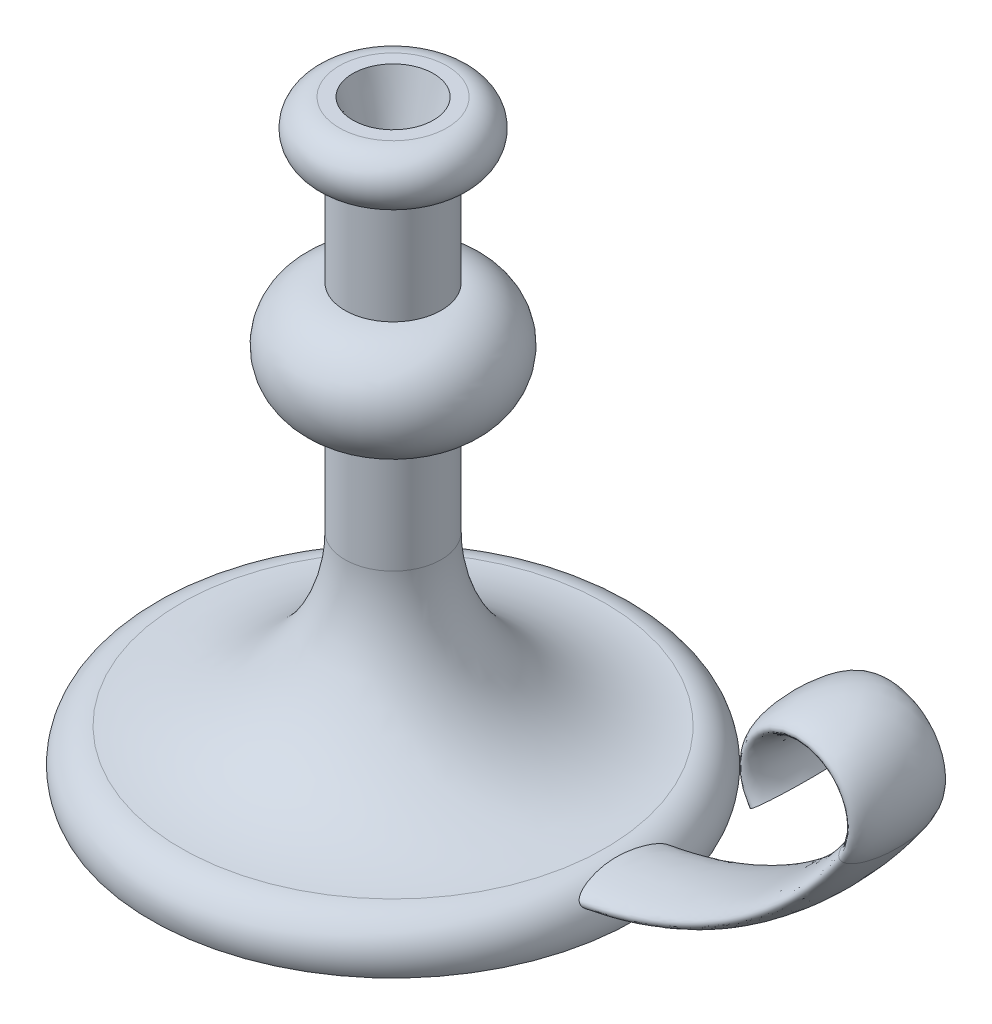
ISO-10303-21;
HEADER;
FILE_DESCRIPTION(('STEP AP214'),'2;1');
FILE_NAME('part.step','',(''),(''),'','','');
FILE_SCHEMA(('AUTOMOTIVE_DESIGN { 1 0 10303 214 1 1 1 1 }'));
ENDSEC;
DATA;
#1=APPLICATION_CONTEXT('core data for automotive mechanical design processes');
#2=APPLICATION_PROTOCOL_DEFINITION('international standard','automotive_design',2000,#1);
#3=PRODUCT_CONTEXT('',#1,'mechanical');
#4=PRODUCT('Part','Part','',(#3));
#5=PRODUCT_RELATED_PRODUCT_CATEGORY('part','',(#4));
#6=PRODUCT_DEFINITION_FORMATION('','',#4);
#7=PRODUCT_DEFINITION_CONTEXT('part definition',#1,'design');
#8=PRODUCT_DEFINITION('design','',#6,#7);
#9=PRODUCT_DEFINITION_SHAPE('','',#8);
#10=(LENGTH_UNIT() NAMED_UNIT(*) SI_UNIT(.MILLI.,.METRE.));
#11=(NAMED_UNIT(*) PLANE_ANGLE_UNIT() SI_UNIT($,.RADIAN.));
#12=(NAMED_UNIT(*) SI_UNIT($,.STERADIAN.) SOLID_ANGLE_UNIT());
#13=UNCERTAINTY_MEASURE_WITH_UNIT(LENGTH_MEASURE(1.E-05),#10,'distance_accuracy_value','');
#14=(GEOMETRIC_REPRESENTATION_CONTEXT(3) GLOBAL_UNCERTAINTY_ASSIGNED_CONTEXT((#13)) GLOBAL_UNIT_ASSIGNED_CONTEXT((#10,
#11,#12)) REPRESENTATION_CONTEXT('',''));
#15=CARTESIAN_POINT('',(0.,0.,0.));
#16=DIRECTION('',(0.,0.,1.));
#17=DIRECTION('',(1.,0.,0.));
#18=AXIS2_PLACEMENT_3D('',#15,#16,#17);
#19=CARTESIAN_POINT('',(0.,0.,0.));
#20=DIRECTION('',(0.,-1.,0.));
#21=DIRECTION('',(0.,0.,-1.));
#22=AXIS2_PLACEMENT_3D('',#19,#20,#21);
#23=PLANE('',#22);
#24=CARTESIAN_POINT('',(0.,0.,0.));
#25=DIRECTION('',(0.,-1.,0.));
#26=DIRECTION('',(0.,0.,-1.));
#27=AXIS2_PLACEMENT_3D('',#24,#25,#26);
#28=CIRCLE('',#27,90.);
#29=CARTESIAN_POINT('',(0.,0.,-90.));
#30=VERTEX_POINT('',#29);
#31=EDGE_CURVE('E78',#30,#30,#28,.T.);
#32=ORIENTED_EDGE('',*,*,#31,.T.);
#33=EDGE_LOOP('',(#32));
#34=FACE_BOUND('',#33,.T.);
#35=ADVANCED_FACE('F38',(#34),#23,.T.);
#36=CARTESIAN_POINT('',(20.,220.,0.));
#37=DIRECTION('',(0.,1.,0.));
#38=DIRECTION('',(0.,0.,1.));
#39=AXIS2_PLACEMENT_3D('',#36,#37,#38);
#40=PLANE('',#39);
#41=CARTESIAN_POINT('',(0.,220.,0.));
#42=DIRECTION('',(0.,1.,0.));
#43=DIRECTION('',(0.,0.,1.));
#44=AXIS2_PLACEMENT_3D('',#41,#42,#43);
#45=CIRCLE('',#44,15.);
#46=CARTESIAN_POINT('',(0.,220.,15.));
#47=VERTEX_POINT('',#46);
#48=EDGE_CURVE('E94',#47,#47,#45,.T.);
#49=ORIENTED_EDGE('',*,*,#48,.F.);
#50=EDGE_LOOP('',(#49));
#51=FACE_BOUND('',#50,.T.);
#52=CARTESIAN_POINT('',(0.,220.,0.));
#53=DIRECTION('',(0.,-1.,0.));
#54=DIRECTION('',(0.,0.,-1.));
#55=AXIS2_PLACEMENT_3D('',#52,#53,#54);
#56=CIRCLE('',#55,20.);
#57=CARTESIAN_POINT('',(0.,220.,-20.));
#58=VERTEX_POINT('',#57);
#59=EDGE_CURVE('E50',#58,#58,#56,.T.);
#60=ORIENTED_EDGE('',*,*,#59,.F.);
#61=EDGE_LOOP('',(#60));
#62=FACE_BOUND('',#61,.T.);
#63=ADVANCED_FACE('F101',(#51,#62),#40,.T.);
#64=CARTESIAN_POINT('',(0.,210.,0.));
#65=DIRECTION('',(0.,-1.,0.));
#66=DIRECTION('',(0.,0.,-1.));
#67=AXIS2_PLACEMENT_3D('',#64,#65,#66);
#68=TOROIDAL_SURFACE('',#67,20.,10.);
#69=ORIENTED_EDGE('',*,*,#59,.T.);
#70=EDGE_LOOP('',(#69));
#71=FACE_BOUND('',#70,.T.);
#72=CARTESIAN_POINT('',(0.,200.221610295999,0.));
#73=DIRECTION('',(0.,-1.,0.));
#74=DIRECTION('',(0.,0.,-1.));
#75=AXIS2_PLACEMENT_3D('',#72,#73,#74);
#76=CIRCLE('',#75,17.9064158013873);
#77=CARTESIAN_POINT('',(0.,200.221610295999,-17.9064158013873));
#78=VERTEX_POINT('',#77);
#79=EDGE_CURVE('E55',#78,#78,#76,.T.);
#80=ORIENTED_EDGE('',*,*,#79,.F.);
#81=EDGE_LOOP('',(#80));
#82=FACE_BOUND('',#81,.T.);
#83=ADVANCED_FACE('F104',(#71,#82),#68,.T.);
#84=CARTESIAN_POINT('',(0.,0.,0.));
#85=DIRECTION('',(0.,-1.,0.));
#86=DIRECTION('',(0.,0.,-1.));
#87=AXIS2_PLACEMENT_3D('',#84,#85,#86);
#88=CYLINDRICAL_SURFACE('',#87,17.9064158013873);
#89=ORIENTED_EDGE('',*,*,#79,.T.);
#90=EDGE_LOOP('',(#89));
#91=FACE_BOUND('',#90,.T.);
#92=CARTESIAN_POINT('',(0.,160.221610295999,0.));
#93=DIRECTION('',(0.,-1.,0.));
#94=DIRECTION('',(0.,0.,-1.));
#95=AXIS2_PLACEMENT_3D('',#92,#93,#94);
#96=CIRCLE('',#95,17.9064158013873);
#97=CARTESIAN_POINT('',(0.,160.221610295999,-17.9064158013873));
#98=VERTEX_POINT('',#97);
#99=EDGE_CURVE('E60',#98,#98,#96,.T.);
#100=ORIENTED_EDGE('',*,*,#99,.F.);
#101=EDGE_LOOP('',(#100));
#102=FACE_BOUND('',#101,.T.);
#103=ADVANCED_FACE('F110',(#91,#102),#88,.T.);
#104=CARTESIAN_POINT('',(0.,140.224286636559,0.));
#105=DIRECTION('',(0.,-1.,0.));
#106=DIRECTION('',(0.,0.,-1.));
#107=AXIS2_PLACEMENT_3D('',#104,#105,#106);
#108=DEGENERATE_TOROIDAL_SURFACE('',#107,17.5792362488077,20.,.T.);
#109=ORIENTED_EDGE('',*,*,#99,.T.);
#110=EDGE_LOOP('',(#109));
#111=FACE_BOUND('',#110,.T.);
#112=CARTESIAN_POINT('',(0.,120.22696297712,0.));
#113=DIRECTION('',(0.,-1.,0.));
#114=DIRECTION('',(0.,0.,-1.));
#115=AXIS2_PLACEMENT_3D('',#112,#113,#114);
#116=CIRCLE('',#115,17.9064158013873);
#117=CARTESIAN_POINT('',(0.,120.22696297712,-17.9064158013873));
#118=VERTEX_POINT('',#117);
#119=EDGE_CURVE('E66',#118,#118,#116,.T.);
#120=ORIENTED_EDGE('',*,*,#119,.F.);
#121=EDGE_LOOP('',(#120));
#122=FACE_BOUND('',#121,.T.);
#123=ADVANCED_FACE('F117',(#111,#122),#108,.T.);
#124=CARTESIAN_POINT('',(0.,0.,0.));
#125=DIRECTION('',(0.,-1.,0.));
#126=DIRECTION('',(0.,0.,-1.));
#127=AXIS2_PLACEMENT_3D('',#124,#125,#126);
#128=CYLINDRICAL_SURFACE('',#127,17.9064158013873);
#129=ORIENTED_EDGE('',*,*,#119,.T.);
#130=EDGE_LOOP('',(#129));
#131=FACE_BOUND('',#130,.T.);
#132=CARTESIAN_POINT('',(0.,80.,0.));
#133=DIRECTION('',(0.,-1.,0.));
#134=DIRECTION('',(0.,0.,-1.));
#135=AXIS2_PLACEMENT_3D('',#132,#133,#134);
#136=CIRCLE('',#135,17.9064158013873);
#137=CARTESIAN_POINT('',(0.,80.,-17.9064158013873));
#138=VERTEX_POINT('',#137);
#139=EDGE_CURVE('E70',#138,#138,#136,.T.);
#140=ORIENTED_EDGE('',*,*,#139,.F.);
#141=EDGE_LOOP('',(#140));
#142=FACE_BOUND('',#141,.T.);
#143=ADVANCED_FACE('F121',(#131,#142),#128,.T.);
#144=CARTESIAN_POINT('',(0.,80.,0.));
#145=DIRECTION('',(0.,-1.,0.));
#146=DIRECTION('',(0.,0.,-1.));
#147=AXIS2_PLACEMENT_3D('',#144,#145,#146);
#148=TOROIDAL_SURFACE('',#147,80.3273110047514,62.4208952033641);
#149=ORIENTED_EDGE('',*,*,#139,.T.);
#150=EDGE_LOOP('',(#149));
#151=FACE_BOUND('',#150,.T.);
#152=CARTESIAN_POINT('',(0.,17.5959392052141,0.));
#153=DIRECTION('',(0.,-1.,0.));
#154=DIRECTION('',(0.,0.,-1.));
#155=AXIS2_PLACEMENT_3D('',#152,#153,#154);
#156=CIRCLE('',#155,78.8777061240963);
#157=CARTESIAN_POINT('',(0.,17.5959392052141,-78.8777061240963));
#158=VERTEX_POINT('',#157);
#159=EDGE_CURVE('E74',#158,#158,#156,.T.);
#160=ORIENTED_EDGE('',*,*,#159,.F.);
#161=EDGE_LOOP('',(#160));
#162=FACE_BOUND('',#161,.T.);
#163=ADVANCED_FACE('F125',(#151,#162),#148,.F.);
#164=CARTESIAN_POINT('',(0.,5.09931035371397,0.));
#165=DIRECTION('',(0.,-1.,0.));
#166=DIRECTION('',(0.,0.,-1.));
#167=AXIS2_PLACEMENT_3D('',#164,#165,#166);
#168=TOROIDAL_SURFACE('',#167,78.5874177367037,12.5);
#169=CARTESIAN_POINT('',(86.9596354377393,12.4426279135326,-17.5));
#170=CARTESIAN_POINT('',(86.9233085066414,12.4916855738166,-17.5000019541123));
#171=CARTESIAN_POINT('',(86.8870373996707,12.540773211843,-17.4968384947292));
#172=CARTESIAN_POINT('',(86.8149401776939,12.6385078342905,-17.4843006987395));
#173=CARTESIAN_POINT('',(86.7791142388102,12.6871546423666,-17.4749239789751));
#174=CARTESIAN_POINT('',(86.7081746766925,12.7835905785823,-17.4502773692844));
#175=CARTESIAN_POINT('',(86.673062445518,12.8313780128748,-17.4349969451215));
#176=CARTESIAN_POINT('',(86.6038309158925,12.9256588325129,-17.3990470385992));
#177=CARTESIAN_POINT('',(86.5697122774033,12.9721513569015,-17.3783740612528));
#178=CARTESIAN_POINT('',(86.4964316011312,13.0720174532536,-17.3279683727697));
#179=CARTESIAN_POINT('',(86.4575041295328,13.1250729694236,-17.2972671650041));
#180=CARTESIAN_POINT('',(86.3813718819795,13.228774466285,-17.230131096435));
#181=CARTESIAN_POINT('',(86.3441684737965,13.2794185347206,-17.1936917808306));
#182=CARTESIAN_POINT('',(86.2714710131231,13.3782573948772,-17.1159909016981));
#183=CARTESIAN_POINT('',(86.2359787549379,13.4264496184081,-17.0747244253316));
#184=CARTESIAN_POINT('',(86.1666840845858,13.5203683461176,-16.9882205055724));
#185=CARTESIAN_POINT('',(86.1328813112041,13.5660953775246,-16.9429839167464));
#186=CARTESIAN_POINT('',(86.040034976807,13.6913971791316,-16.8111443253316));
#187=CARTESIAN_POINT('',(85.9827706080425,13.7683241092562,-16.7207642595454));
#188=CARTESIAN_POINT('',(85.8726340130731,13.9154367264162,-16.5321717622932));
#189=CARTESIAN_POINT('',(85.8197656801678,13.9856164462754,-16.4339525358881));
#190=CARTESIAN_POINT('',(85.7176337315374,14.1202536115642,-16.2314959461551));
#191=CARTESIAN_POINT('',(85.6683796398264,14.1846960273544,-16.1272438920407));
#192=CARTESIAN_POINT('',(85.5730590773266,14.3084157508301,-15.9144058054218));
#193=CARTESIAN_POINT('',(85.5269914533963,14.367694929059,-15.8058213634215));
#194=CARTESIAN_POINT('',(85.4361887578111,14.4835040488091,-15.5819227310362));
#195=CARTESIAN_POINT('',(85.3915363653906,14.5398962514976,-15.4665043192512));
#196=CARTESIAN_POINT('',(85.304659062824,14.6485277543982,-15.232821017184));
#197=CARTESIAN_POINT('',(85.2624345936482,14.70076630086,-15.1145556153173));
#198=CARTESIAN_POINT('',(85.1800206563138,14.8016461258387,-14.87556426715));
#199=CARTESIAN_POINT('',(85.1398345642576,14.8502814941702,-14.7548346752232));
#200=CARTESIAN_POINT('',(85.0613014120098,14.9442633111444,-14.5115067801068));
#201=CARTESIAN_POINT('',(85.0229545177851,14.989609463161,-14.3889083095824));
#202=CARTESIAN_POINT('',(84.910284708748,15.1212890708345,-14.0186256991278));
#203=CARTESIAN_POINT('',(84.8383893858875,15.2031944437593,-13.7686216891346));
#204=CARTESIAN_POINT('',(84.6994618440362,15.3576440041727,-13.2629547294844));
#205=CARTESIAN_POINT('',(84.6324566762892,15.4301376281907,-13.0072692123984));
#206=CARTESIAN_POINT('',(84.5029639695221,15.5666893435914,-12.4928667186692));
#207=CARTESIAN_POINT('',(84.4404714090979,15.6307568784284,-12.2341534957487));
#208=CARTESIAN_POINT('',(84.3194017130899,15.7516576097691,-11.7142192056508));
#209=CARTESIAN_POINT('',(84.2608236221116,15.8084925745928,-11.4529987683341));
#210=CARTESIAN_POINT('',(84.1404530132319,15.9222188904989,-10.8971752307501));
#211=CARTESIAN_POINT('',(84.0791119052639,15.9783065862316,-10.6023105680649));
#212=CARTESIAN_POINT('',(83.9606563898295,16.0834685607291,-10.01047644444));
#213=CARTESIAN_POINT('',(83.9035422897429,16.1325423296958,-9.71350683214964));
#214=CARTESIAN_POINT('',(83.7934341024099,16.224449312158,-9.11757686418804));
#215=CARTESIAN_POINT('',(83.7404435889538,16.2672771399678,-8.8186150202103));
#216=CARTESIAN_POINT('',(83.6387086560238,16.3472305658702,-8.219206183328));
#217=CARTESIAN_POINT('',(83.5899644116283,16.3843559288918,-7.91875912972578));
#218=CARTESIAN_POINT('',(83.4503001028087,16.4879501828174,-7.01523854915912));
#219=CARTESIAN_POINT('',(83.3659914911336,16.5466023062192,-6.41021765109231));
#220=CARTESIAN_POINT('',(83.2174491959584,16.6457828842759,-5.1982013841654));
#221=CARTESIAN_POINT('',(83.15315341714,16.686367570214,-4.59121814831359));
#222=CARTESIAN_POINT('',(83.0469673404779,16.7515267726735,-3.37478205504076));
#223=CARTESIAN_POINT('',(83.005063690075,16.7761108323744,-2.76533088823268));
#224=CARTESIAN_POINT('',(82.9458600115289,16.8104291535616,-1.5450390340982));
#225=CARTESIAN_POINT('',(82.9285502629538,16.8201692820365,-0.934198991372331));
#226=CARTESIAN_POINT('',(82.9200697692064,16.82496078374,0.216488656765294));
#227=CARTESIAN_POINT('',(82.9260871372991,16.8215921144806,0.756311159802022));
#228=CARTESIAN_POINT('',(82.9578039825934,16.803495769125,1.83521730830526));
#229=CARTESIAN_POINT('',(82.9835045995887,16.7887674352267,2.37430090917327));
#230=CARTESIAN_POINT('',(83.053358993603,16.7474661327064,3.4497418501715));
#231=CARTESIAN_POINT('',(83.0974766656698,16.7209163322429,3.98610245743619));
#232=CARTESIAN_POINT('',(83.2024602053469,16.6550395741401,5.0563635939192));
#233=CARTESIAN_POINT('',(83.2633249127797,16.6157135015633,5.59026429094761));
#234=CARTESIAN_POINT('',(83.3688077019594,16.5440600514526,6.4117465576799));
#235=CARTESIAN_POINT('',(83.408150412391,16.51673906254,6.70046161245483));
#236=CARTESIAN_POINT('',(83.4910119604882,16.4575951762599,7.27683765904184));
#237=CARTESIAN_POINT('',(83.5345308407221,16.4257722330017,7.56449864007856));
#238=CARTESIAN_POINT('',(83.6255511785553,16.3572603249952,8.13865472991985));
#239=CARTESIAN_POINT('',(83.6730532457049,16.32057061498,8.42514965322206));
#240=CARTESIAN_POINT('',(83.7722405232891,16.2416222588448,8.99869269180586));
#241=CARTESIAN_POINT('',(83.8239519960933,16.1993274211537,9.28573130851178));
#242=CARTESIAN_POINT('',(83.9312260500353,16.1088223136011,9.85811402986387));
#243=CARTESIAN_POINT('',(83.9867881076555,16.0606128471964,10.1434583591571));
#244=CARTESIAN_POINT('',(84.1018210977995,15.9576173513427,10.7120370437845));
#245=CARTESIAN_POINT('',(84.1612902445605,15.9028343170571,10.9952722980839));
#246=CARTESIAN_POINT('',(84.2696333031533,15.7998432181965,11.491653523123));
#247=CARTESIAN_POINT('',(84.3176277989563,15.7532092020781,11.7053181291563));
#248=CARTESIAN_POINT('',(84.416216699494,15.6551464101039,12.1309767217212));
#249=CARTESIAN_POINT('',(84.4668114274367,15.6037170375367,12.3429704967734));
#250=CARTESIAN_POINT('',(84.570913408547,15.4954331613959,12.7650709744191));
#251=CARTESIAN_POINT('',(84.6244232513958,15.4385737991142,12.9751757993791));
#252=CARTESIAN_POINT('',(84.7348179365349,15.3186056204887,13.3932000560187));
#253=CARTESIAN_POINT('',(84.7917093866012,15.2554843958319,13.6011142076114));
#254=CARTESIAN_POINT('',(84.9086193852613,15.1229327484087,14.011081056245));
#255=CARTESIAN_POINT('',(84.9685918766599,15.0535877167933,14.2131742157423));
#256=CARTESIAN_POINT('',(85.0930173302834,14.9067700119576,14.6128954436231));
#257=CARTESIAN_POINT('',(85.1574682801579,14.8293009813082,14.8105254652515));
#258=CARTESIAN_POINT('',(85.291790340155,14.664781228661,15.1993046966249));
#259=CARTESIAN_POINT('',(85.3616469105952,14.5777559628361,15.3904694314705));
#260=CARTESIAN_POINT('',(85.471685059611,14.4383439081581,15.6704686615754));
#261=CARTESIAN_POINT('',(85.5092015683926,14.3904442877752,15.7625921126073));
#262=CARTESIAN_POINT('',(85.5862646107053,14.2913048304305,15.9441441820198));
#263=CARTESIAN_POINT('',(85.6258106978423,14.2400657273052,16.0335733861755));
#264=CARTESIAN_POINT('',(85.6972727345487,14.1468333263236,16.1876029567963));
#265=CARTESIAN_POINT('',(85.7286874744816,14.1056461658363,16.2529235081447));
#266=CARTESIAN_POINT('',(85.7930079375056,14.0209181468223,16.3812890502831));
#267=CARTESIAN_POINT('',(85.8259138641553,13.9773769667961,16.4443337282755));
#268=CARTESIAN_POINT('',(85.8934644403349,13.8876157684482,16.5678158234217));
#269=CARTESIAN_POINT('',(85.9281131889532,13.8413893909102,16.6282464063839));
#270=CARTESIAN_POINT('',(85.9992585632897,13.7461226495883,16.7457235003655));
#271=CARTESIAN_POINT('',(86.0357551620186,13.6970823269028,16.8027700607848));
#272=CARTESIAN_POINT('',(86.1113268588065,13.5952292027641,16.9134948576911));
#273=CARTESIAN_POINT('',(86.1504315489824,13.542372200783,16.967112663756));
#274=CARTESIAN_POINT('',(86.230926292479,13.4333159232872,17.0690449081826));
#275=CARTESIAN_POINT('',(86.2723168135239,13.3771159635574,17.1173582550635));
#276=CARTESIAN_POINT('',(86.3573318527817,13.2615116871773,17.2072159177757));
#277=CARTESIAN_POINT('',(86.4009475295062,13.2021200089404,17.2487846404837));
#278=CARTESIAN_POINT('',(86.49051577111,13.0800881719698,17.3238362996097));
#279=CARTESIAN_POINT('',(86.5364662547451,13.0174509053985,17.3573262894711));
#280=CARTESIAN_POINT('',(86.6123773162219,12.9140211179302,17.403616159395));
#281=CARTESIAN_POINT('',(86.6416938877068,12.8740879607165,17.4194205337424));
#282=CARTESIAN_POINT('',(86.7010031570292,12.7933552713419,17.4470210938069));
#283=CARTESIAN_POINT('',(86.7309956287249,12.7525560292121,17.4588185995136));
#284=CARTESIAN_POINT('',(86.7914893792021,12.6703525023217,17.4781102699119));
#285=CARTESIAN_POINT('',(86.8219903731471,12.6289485577823,17.4856067655487));
#286=CARTESIAN_POINT('',(86.8833093998752,12.5458290508224,17.4961057213166));
#287=CARTESIAN_POINT('',(86.9141273031466,12.5041136174689,17.499109949139));
#288=CARTESIAN_POINT('',(86.9759347849085,12.4205984629669,17.5005502837694));
#289=CARTESIAN_POINT('',(87.0069245836229,12.3787987403526,17.498977228581));
#290=CARTESIAN_POINT('',(87.0687804773937,12.2955392320499,17.4913058461737));
#291=CARTESIAN_POINT('',(87.0996465725091,12.2540794461994,17.4852075211131));
#292=CARTESIAN_POINT('',(87.1917798236906,12.1306166157815,17.46034985279));
#293=CARTESIAN_POINT('',(87.2525825309953,12.0495293065714,17.4350278250647));
#294=CARTESIAN_POINT('',(87.3896272409163,11.8677618455945,17.359389269135));
#295=CARTESIAN_POINT('',(87.4649416726157,11.7686219580001,17.3038136937579));
#296=CARTESIAN_POINT('',(87.6100359173094,11.5790873532173,17.1736917518313));
#297=CARTESIAN_POINT('',(87.6798013528107,11.4887152283678,17.0990980836013));
#298=CARTESIAN_POINT('',(87.8040119795811,11.3290685553327,16.948281845704));
#299=CARTESIAN_POINT('',(87.8592116279177,11.2586350990118,16.8738645563858));
#300=CARTESIAN_POINT('',(87.9659185562906,11.123384102413,16.7175793859323));
#301=CARTESIAN_POINT('',(88.0174228595489,11.0585710810891,16.6357056160847));
#302=CARTESIAN_POINT('',(88.1171760591481,10.9338583982317,16.4661827617776));
#303=CARTESIAN_POINT('',(88.1654186644612,10.8739681861821,16.3785231268162));
#304=CARTESIAN_POINT('',(88.2589110297869,10.75863778501,16.1988603298977));
#305=CARTESIAN_POINT('',(88.3041615721834,10.7031964317548,16.1068583142844));
#306=CARTESIAN_POINT('',(88.3972195696891,10.5898779936932,15.9083136213279));
#307=CARTESIAN_POINT('',(88.4446957030913,10.5324893496924,15.801338810353));
#308=CARTESIAN_POINT('',(88.5367389165811,10.4219551227477,15.5840054946164));
#309=CARTESIAN_POINT('',(88.5813057127562,10.3688099537979,15.4736466611592));
#310=CARTESIAN_POINT('',(88.6677738787417,10.2663430438289,15.2504242789792));
#311=CARTESIAN_POINT('',(88.7096798727624,10.2170146351098,15.1375655625459));
#312=CARTESIAN_POINT('',(88.7911763762987,10.1216565265733,14.9096558387989));
#313=CARTESIAN_POINT('',(88.8307669839655,10.075626686908,14.7946049246888));
#314=CARTESIAN_POINT('',(88.9189119006651,9.97372983665588,14.5294253052261));
#315=CARTESIAN_POINT('',(88.9667810049685,9.91882707106169,14.3786985879219));
#316=CARTESIAN_POINT('',(89.0594388046702,9.81328411603351,14.0748176461523));
#317=CARTESIAN_POINT('',(89.1042270837055,9.76264450254364,13.9216630970019));
#318=CARTESIAN_POINT('',(89.234530759338,9.61626530865435,13.4589132747595));
#319=CARTESIAN_POINT('',(89.3158826997842,9.52618301495104,13.1463457321523));
#320=CARTESIAN_POINT('',(89.4693002645513,9.35817224614987,12.5156060375813));
#321=CARTESIAN_POINT('',(89.5413606785908,9.28025058509587,12.1974308537816));
#322=CARTESIAN_POINT('',(89.6778152447229,9.13414468660293,11.5548670757517));
#323=CARTESIAN_POINT('',(89.7421538313256,9.06603039515715,11.2304509203642));
#324=CARTESIAN_POINT('',(89.8634204371239,8.93876747278326,10.5787707178593));
#325=CARTESIAN_POINT('',(89.920353924628,8.87961222066819,10.2515089648062));
#326=CARTESIAN_POINT('',(90.0274952973747,8.76914376456887,9.5946330485578));
#327=CARTESIAN_POINT('',(90.0777041837714,8.71782939307893,9.265019243248));
#328=CARTESIAN_POINT('',(90.169956782589,8.62417630188547,8.61741192728384));
#329=CARTESIAN_POINT('',(90.2122504135416,8.58155637274074,8.29949434963547));
#330=CARTESIAN_POINT('',(90.2914163321261,8.50222737049918,7.66224467275723));
#331=CARTESIAN_POINT('',(90.328288368887,8.46551857091802,7.34291250877467));
#332=CARTESIAN_POINT('',(90.43120936056,8.36353615913186,6.38273403815759));
#333=CARTESIAN_POINT('',(90.4894994298955,8.30647070871799,5.7401596496362));
#334=CARTESIAN_POINT('',(90.5868098613306,8.2117530714117,4.45164320146203));
#335=CARTESIAN_POINT('',(90.6258139247926,8.17411730339837,3.805698757992));
#336=CARTESIAN_POINT('',(90.6852793264536,8.11691249062666,2.51189795917929));
#337=CARTESIAN_POINT('',(90.7057330222629,8.09735089201139,1.86404092605889));
#338=CARTESIAN_POINT('',(90.728415138312,8.07566537888104,0.569925010418988));
#339=CARTESIAN_POINT('',(90.7307051682758,8.07348251696501,-0.076331835146723));
#340=CARTESIAN_POINT('',(90.7172668797676,8.08632147534943,-1.36810229558877));
#341=CARTESIAN_POINT('',(90.7015494614874,8.10133288768382,-2.01361612357366));
#342=CARTESIAN_POINT('',(90.6518414642044,8.14905020180492,-3.30286514754432));
#343=CARTESIAN_POINT('',(90.6178628567802,8.1817445112162,-3.94660123138412));
#344=CARTESIAN_POINT('',(90.5309996573325,8.26598521918038,-5.23127790983363));
#345=CARTESIAN_POINT('',(90.4781249080671,8.31752180335532,-5.87221978430742));
#346=CARTESIAN_POINT('',(90.3836082789499,8.41067778739981,-6.83195911517219));
#347=CARTESIAN_POINT('',(90.3494786651236,8.44446157753347,-7.15228111281294));
#348=CARTESIAN_POINT('',(90.2759247653865,8.51771109726481,-7.79166974176312));
#349=CARTESIAN_POINT('',(90.2365005633578,8.55717673684594,-8.11073639287853));
#350=CARTESIAN_POINT('',(90.1520857951829,8.64226533024619,-8.74726198351826));
#351=CARTESIAN_POINT('',(90.107096068875,8.68788735516035,-9.0647211581034));
#352=CARTESIAN_POINT('',(90.011183623132,8.78591413277606,-9.69769094805238));
#353=CARTESIAN_POINT('',(89.9602611292924,8.83831862758024,-10.013201637028));
#354=CARTESIAN_POINT('',(89.867720121854,8.93440417677197,-10.5505111165937));
#355=CARTESIAN_POINT('',(89.8276927863219,8.97620057997508,-10.7729221067272));
#356=CARTESIAN_POINT('',(89.7441893551305,9.06398653723324,-11.2162617896431));
#357=CARTESIAN_POINT('',(89.7007133808707,9.10997594369411,-11.4371905343069));
#358=CARTESIAN_POINT('',(89.6101020540283,9.206533551118,-11.8769754113926));
#359=CARTESIAN_POINT('',(89.5629716398274,9.25709558777821,-12.0958339074254));
#360=CARTESIAN_POINT('',(89.4646655813137,9.36340541708885,-12.5313623523158));
#361=CARTESIAN_POINT('',(89.4134902609068,9.4191527945734,-12.748032474849));
#362=CARTESIAN_POINT('',(89.3067469127825,9.53644728803808,-13.1783041613138));
#363=CARTESIAN_POINT('',(89.2511863603114,9.59798456730674,-13.3919102437724));
#364=CARTESIAN_POINT('',(89.1348542146252,9.72805074434084,-13.8163568012808));
#365=CARTESIAN_POINT('',(89.0740668744305,9.79660089683886,-14.0271865435436));
#366=CARTESIAN_POINT('',(88.9673509027979,9.91819283952726,-14.3765851202756));
#367=CARTESIAN_POINT('',(88.9230030292153,9.96904699307297,-14.5163982911311));
#368=CARTESIAN_POINT('',(88.8313352858411,10.0749305116469,-14.7935008342202));
#369=CARTESIAN_POINT('',(88.7840147128777,10.1299608651719,-14.9307895993196));
#370=CARTESIAN_POINT('',(88.6859864519586,10.2448417525788,-15.2023048426091));
#371=CARTESIAN_POINT('',(88.6352753022488,10.3046972260998,-15.3365279973652));
#372=CARTESIAN_POINT('',(88.5303044425397,10.4296124202994,-15.6001872579385));
#373=CARTESIAN_POINT('',(88.4760643101442,10.4946438123127,-15.7296444215881));
#374=CARTESIAN_POINT('',(88.3632664205427,10.631049543534,-15.9831009678563));
#375=CARTESIAN_POINT('',(88.3047122775589,10.7024185832076,-16.1071047831938));
#376=CARTESIAN_POINT('',(88.1826028286795,10.8526047823759,-16.3477081392916));
#377=CARTESIAN_POINT('',(88.119056553044,10.9314085428575,-16.4643203901153));
#378=CARTESIAN_POINT('',(88.0208962110657,11.0542937684067,-16.6289249555528));
#379=CARTESIAN_POINT('',(87.9885664634151,11.0949365247516,-16.6808601508432));
#380=CARTESIAN_POINT('',(87.9224561269433,11.1784176085199,-16.7819895062355));
#381=CARTESIAN_POINT('',(87.8886754608342,11.2212560529276,-16.8311835199977));
#382=CARTESIAN_POINT('',(87.8195635912058,11.3092954994386,-16.9263012776228));
#383=CARTESIAN_POINT('',(87.7842321706791,11.3544968323669,-16.9722245614172));
#384=CARTESIAN_POINT('',(87.7119695977968,11.4473644163352,-17.0601107868552));
#385=CARTESIAN_POINT('',(87.6750386871306,11.4950302951817,-17.1020743238077));
#386=CARTESIAN_POINT('',(87.5727801052885,11.627610103547,-17.2092874109821));
#387=CARTESIAN_POINT('',(87.5058135572503,11.7150608170702,-17.2700584159396));
#388=CARTESIAN_POINT('',(87.4021227091453,11.8514759231092,-17.3471483193044));
#389=CARTESIAN_POINT('',(87.3670464508099,11.8977840948383,-17.3704882696455));
#390=CARTESIAN_POINT('',(87.2959334660024,11.9919899442083,-17.4118767845426));
#391=CARTESIAN_POINT('',(87.2598971999117,12.0398868625583,-17.4299278373274));
#392=CARTESIAN_POINT('',(87.1801937584315,12.1461586162929,-17.4629974664776));
#393=CARTESIAN_POINT('',(87.1363712329617,12.204803310097,-17.4767986950266));
#394=CARTESIAN_POINT('',(87.0482166648907,12.3231598354042,-17.4952986362467));
#395=CARTESIAN_POINT('',(87.0038846374878,12.3828716351051,-17.49999761973));
#396=CARTESIAN_POINT('',(86.9596354377393,12.4426279135326,-17.5));
#397=B_SPLINE_CURVE_WITH_KNOTS('',3,(#169,#170,#171,#172,#173,#174,#175,#176,#177,#178,#179,
#180,#181,#182,#183,#184,#185,#186,#187,#188,#189,#190,#191,#192,#193,#194,#195,#196,#197,#198,
#199,#200,#201,#202,#203,#204,#205,#206,#207,#208,#209,#210,#211,#212,#213,#214,#215,#216,#217,
#218,#219,#220,#221,#222,#223,#224,#225,#226,#227,#228,#229,#230,#231,#232,#233,#234,#235,#236,
#237,#238,#239,#240,#241,#242,#243,#244,#245,#246,#247,#248,#249,#250,#251,#252,#253,#254,#255,
#256,#257,#258,#259,#260,#261,#262,#263,#264,#265,#266,#267,#268,#269,#270,#271,#272,#273,#274,
#275,#276,#277,#278,#279,#280,#281,#282,#283,#284,#285,#286,#287,#288,#289,#290,#291,#292,#293,
#294,#295,#296,#297,#298,#299,#300,#301,#302,#303,#304,#305,#306,#307,#308,#309,#310,#311,#312,
#313,#314,#315,#316,#317,#318,#319,#320,#321,#322,#323,#324,#325,#326,#327,#328,#329,#330,#331,
#332,#333,#334,#335,#336,#337,#338,#339,#340,#341,#342,#343,#344,#345,#346,#347,#348,#349,#350,
#351,#352,#353,#354,#355,#356,#357,#358,#359,#360,#361,#362,#363,#364,#365,#366,#367,#368,#369,
#370,#371,#372,#373,#374,#375,#376,#377,#378,#379,#380,#381,#382,#383,#384,#385,#386,#387,#388,
#389,#390,#391,#392,#393,#394,#395,#396),.UNSPECIFIED.,.T.,.F.,(4,2,2,2,2,2,2,2,2,2,2,2,2,2,2,2,
2,2,2,2,2,2,2,2,2,2,2,2,2,2,2,2,2,2,2,2,2,2,2,2,2,2,2,2,2,2,2,2,2,2,2,2,2,2,2,2,2,2,2,2,2,2,2,2,
2,2,2,2,2,2,2,2,2,2,2,2,2,2,2,2,2,2,2,2,2,2,2,2,2,2,2,2,2,2,2,2,2,2,2,2,2,2,2,2,2,2,2,2,2,2,2,2,
2,4),(0.,0.183034019378719,0.36613828394487,0.549570789687388,0.733122477195655,
0.950628433687019,1.16830409187658,1.38620324901185,1.60405561785755,1.99870897299005,
2.39370820605596,2.78971348500486,3.18557469676178,3.59343133593613,4.00136181940765,
4.40994724828421,4.81856947827915,5.6363823888728,6.45842154165514,7.27953140564178,
8.1004401259016,9.01937313047818,9.93837289255089,10.8581604535524,11.7779859205054,
13.618351907712,15.4529493811227,17.2864516489094,19.1192290460933,20.7383531351542,
22.3575709895823,23.973629312718,25.5895757090159,26.4675047818856,27.3454428045653,
28.2235154248425,29.1075622881633,29.9914891932153,30.8750148666008,31.5466495384566,
32.218367897171,32.8906930381158,33.5643781103244,34.2299280780252,34.8951808976484,
35.5587027217491,35.8898302009123,36.2208851600294,36.4709208022078,36.7209906796227,
36.9716790544908,37.2223637689176,37.4766632136561,37.7310148870615,37.984424551911,
38.2376121605259,38.3934649173659,38.5492662814486,38.704983128565,38.8606386855218,
39.0166060204574,39.1725732810003,39.4845048878779,39.8912922928289,40.299101498619,
40.6477650859241,40.9967064563946,41.3463027061054,41.6958071766367,42.0866806674313,
42.477592245427,42.8678047322798,43.2580006656888,43.7600905674966,44.2622481922509,
45.2676129891598,46.2735391213016,47.2863175140017,48.2983437204227,49.3102190891741,
50.280720512108,51.2512668285116,53.193746485147,55.1378649409567,57.082783972311,
59.0211031582756,60.9582496687626,62.8941277808365,64.8289989850505,65.8006273093633,
66.7722402420298,67.7437067366516,68.7151363029727,69.4045274249078,70.0938942895618,
70.7823452999755,71.4707412367202,72.1579880497147,72.8473832241055,73.3130279932051,
73.7787833251856,74.2450216741569,74.7088637601314,75.1723215698912,75.6349595258243,
75.8552180165262,76.0754882546157,76.2957894154905,76.5160574033124,76.891848878126,
77.0794633044815,77.266989323011,77.4899464960262,77.7128970354603),.UNSPECIFIED.);
#398=CARTESIAN_POINT('',(86.9596354377393,12.4426279135326,-17.5));
#399=VERTEX_POINT('',#398);
#400=EDGE_CURVE('E10',#399,#399,#397,.T.);
#401=ORIENTED_EDGE('',*,*,#400,.F.);
#402=EDGE_LOOP('',(#401));
#403=FACE_BOUND('',#402,.T.);
#404=ORIENTED_EDGE('',*,*,#159,.T.);
#405=EDGE_LOOP('',(#404));
#406=FACE_BOUND('',#405,.T.);
#407=ORIENTED_EDGE('',*,*,#31,.F.);
#408=EDGE_LOOP('',(#407));
#409=FACE_BOUND('',#408,.T.);
#410=ADVANCED_FACE('F128',(#403,#406,#409),#168,.T.);
#411=CARTESIAN_POINT('',(150.634185358261,75.,0.));
#412=DIRECTION('',(0.566666666666666,-0.823947139620552,0.));
#413=DIRECTION('',(0.,0.,-1.));
#414=AXIS2_PLACEMENT_3D('',#411,#412,#413);
#415=PLANE('',#414);
#416=CARTESIAN_POINT('',(150.634185358261,75.,0.));
#417=DIRECTION('',(0.566666666666666,-0.823947139620552,0.));
#418=DIRECTION('',(0.,0.,-1.));
#419=AXIS2_PLACEMENT_3D('',#416,#417,#418);
#420=ELLIPSE('',#419,17.5,5.);
#421=CARTESIAN_POINT('',(150.634185358261,75.,-17.5));
#422=VERTEX_POINT('',#421);
#423=EDGE_CURVE('E82',#422,#422,#420,.T.);
#424=ORIENTED_EDGE('',*,*,#423,.T.);
#425=EDGE_LOOP('',(#424));
#426=FACE_BOUND('',#425,.T.);
#427=ADVANCED_FACE('F133',(#426),#415,.T.);
#428=CARTESIAN_POINT('',(60.,10.,-17.5));
#429=CARTESIAN_POINT('',(110.410191303973,10.,-17.5));
#430=CARTESIAN_POINT('',(155.026295870831,33.4646670673665,-17.5));
#431=CARTESIAN_POINT('',(183.592070943083,75.,-17.5));
#432=CARTESIAN_POINT('',(60.,20.,-17.5));
#433=CARTESIAN_POINT('',(107.049511883708,20.,-17.5));
#434=CARTESIAN_POINT('',(148.691209479443,41.9003559295421,-17.5));
#435=CARTESIAN_POINT('',(175.352599546877,80.6666666666666,-17.5));
#436=CARTESIAN_POINT('',(60.,20.,17.5));
#437=CARTESIAN_POINT('',(107.049511883708,20.,17.5));
#438=CARTESIAN_POINT('',(148.691209479443,41.9003559295421,17.5));
#439=CARTESIAN_POINT('',(175.352599546877,80.6666666666666,17.5));
#440=CARTESIAN_POINT('',(60.,10.,17.5));
#441=CARTESIAN_POINT('',(110.410191303973,10.,17.5));
#442=CARTESIAN_POINT('',(155.026295870831,33.4646670673665,17.5));
#443=CARTESIAN_POINT('',(183.592070943083,75.,17.5));
#444=CARTESIAN_POINT('',(60.,0.,17.5));
#445=CARTESIAN_POINT('',(113.770870724238,0.,17.5));
#446=CARTESIAN_POINT('',(161.36138226222,25.0289782051909,17.5));
#447=CARTESIAN_POINT('',(191.831542339288,69.3333333333333,17.5));
#448=CARTESIAN_POINT('',(60.,0.,-17.5));
#449=CARTESIAN_POINT('',(113.770870724238,0.,-17.5));
#450=CARTESIAN_POINT('',(161.36138226222,25.0289782051909,-17.5));
#451=CARTESIAN_POINT('',(191.831542339288,69.3333333333333,-17.5));
#452=CARTESIAN_POINT('',(60.,10.,-17.5));
#453=CARTESIAN_POINT('',(110.410191303973,10.,-17.5));
#454=CARTESIAN_POINT('',(155.026295870831,33.4646670673665,-17.5));
#455=CARTESIAN_POINT('',(183.592070943083,75.,-17.5));
#456=(BOUNDED_SURFACE() B_SPLINE_SURFACE(3,3,((#428,#429,#430,#431),(#432,#433,#434,#435),(#436,
#437,#438,#439),(#440,#441,#442,#443),(#444,#445,#446,#447),(#448,#449,#450,#451),(#452,#453,
#454,#455)),.UNSPECIFIED.,.T.,.F.,.F.) B_SPLINE_SURFACE_WITH_KNOTS((4,3,4),(4,4),(0.,0.5,1.),
(0.,1.),.UNSPECIFIED.) GEOMETRIC_REPRESENTATION_ITEM() RATIONAL_B_SPLINE_SURFACE(((1.,
0.923374135437856,0.923374135437856,1.),(0.333333333333333,0.307791378479285,0.307791378479285,
0.333333333333333),(0.333333333333333,0.307791378479285,0.307791378479285,0.333333333333333),
(1.,0.923374135437856,0.923374135437856,1.),(0.333333333333333,0.307791378479285,
0.307791378479285,0.333333333333333),(0.333333333333333,0.307791378479285,0.307791378479285,
0.333333333333333),(1.,0.923374135437856,0.923374135437856,1.))) REPRESENTATION_ITEM('') SURFACE());
#457=CARTESIAN_POINT('',(183.592070943083,75.,0.));
#458=DIRECTION('',(0.566666666666667,0.823947139620552,0.));
#459=DIRECTION('',(0.,0.,-1.));
#460=AXIS2_PLACEMENT_3D('',#457,#458,#459);
#461=ELLIPSE('',#460,17.5,5.);
#462=CARTESIAN_POINT('',(183.592070943083,75.,-17.5));
#463=VERTEX_POINT('',#462);
#464=EDGE_CURVE('E86',#463,#463,#461,.T.);
#465=ORIENTED_EDGE('',*,*,#400,.T.);
#466=EDGE_LOOP('',(#465));
#467=FACE_BOUND('',#466,.T.);
#468=ORIENTED_EDGE('',*,*,#464,.F.);
#469=EDGE_LOOP('',(#468));
#470=FACE_BOUND('',#469,.T.);
#471=ADVANCED_FACE('F138',(#467,#470),#456,.T.);
#472=CARTESIAN_POINT('',(183.592070943083,75.,-17.5));
#473=CARTESIAN_POINT('',(193.981461744242,90.10642735238,-17.5));
#474=CARTESIAN_POINT('',(185.447347211541,106.333333333333,-17.5));
#475=CARTESIAN_POINT('',(167.113128150672,106.333333333333,-17.5));
#476=CARTESIAN_POINT('',(148.778909089802,106.333333333333,-17.5));
#477=CARTESIAN_POINT('',(140.244794557101,90.1064273523801,-17.5));
#478=CARTESIAN_POINT('',(150.634185358261,75.,-17.5));
#479=CARTESIAN_POINT('',(175.352599546877,80.6666666666667,-17.5));
#480=CARTESIAN_POINT('',(180.547294947457,88.2198803428567,-17.5));
#481=CARTESIAN_POINT('',(176.280237681107,96.3333333333333,-17.5));
#482=CARTESIAN_POINT('',(167.113128150672,96.3333333333333,-17.5));
#483=CARTESIAN_POINT('',(157.946018620237,96.3333333333333,-17.5));
#484=CARTESIAN_POINT('',(153.678961353887,88.2198803428567,-17.5));
#485=CARTESIAN_POINT('',(158.873656754466,80.6666666666667,-17.5));
#486=CARTESIAN_POINT('',(175.352599546877,80.6666666666667,17.5));
#487=CARTESIAN_POINT('',(180.547294947457,88.2198803428567,17.5));
#488=CARTESIAN_POINT('',(176.280237681107,96.3333333333333,17.5));
#489=CARTESIAN_POINT('',(167.113128150672,96.3333333333333,17.5));
#490=CARTESIAN_POINT('',(157.946018620237,96.3333333333333,17.5));
#491=CARTESIAN_POINT('',(153.678961353887,88.2198803428567,17.5));
#492=CARTESIAN_POINT('',(158.873656754466,80.6666666666667,17.5));
#493=CARTESIAN_POINT('',(183.592070943083,75.,17.5));
#494=CARTESIAN_POINT('',(193.981461744242,90.10642735238,17.5));
#495=CARTESIAN_POINT('',(185.447347211541,106.333333333333,17.5));
#496=CARTESIAN_POINT('',(167.113128150672,106.333333333333,17.5));
#497=CARTESIAN_POINT('',(148.778909089802,106.333333333333,17.5));
#498=CARTESIAN_POINT('',(140.244794557101,90.1064273523801,17.5));
#499=CARTESIAN_POINT('',(150.634185358261,75.,17.5));
#500=CARTESIAN_POINT('',(191.831542339288,69.3333333333333,17.5));
#501=CARTESIAN_POINT('',(207.415628541028,91.9929743619034,17.5));
#502=CARTESIAN_POINT('',(194.614456741976,116.333333333333,17.5));
#503=CARTESIAN_POINT('',(167.113128150672,116.333333333333,17.5));
#504=CARTESIAN_POINT('',(139.611799559367,116.333333333333,17.5));
#505=CARTESIAN_POINT('',(126.810627760316,91.9929743619035,17.5));
#506=CARTESIAN_POINT('',(142.394713962055,69.3333333333334,17.5));
#507=CARTESIAN_POINT('',(191.831542339288,69.3333333333333,-17.5));
#508=CARTESIAN_POINT('',(207.415628541028,91.9929743619034,-17.5));
#509=CARTESIAN_POINT('',(194.614456741976,116.333333333333,-17.5));
#510=CARTESIAN_POINT('',(167.113128150672,116.333333333333,-17.5));
#511=CARTESIAN_POINT('',(139.611799559367,116.333333333333,-17.5));
#512=CARTESIAN_POINT('',(126.810627760316,91.9929743619035,-17.5));
#513=CARTESIAN_POINT('',(142.394713962055,69.3333333333334,-17.5));
#514=CARTESIAN_POINT('',(183.592070943083,75.,-17.5));
#515=CARTESIAN_POINT('',(193.981461744242,90.10642735238,-17.5));
#516=CARTESIAN_POINT('',(185.447347211541,106.333333333333,-17.5));
#517=CARTESIAN_POINT('',(167.113128150672,106.333333333333,-17.5));
#518=CARTESIAN_POINT('',(148.778909089802,106.333333333333,-17.5));
#519=CARTESIAN_POINT('',(140.244794557101,90.1064273523801,-17.5));
#520=CARTESIAN_POINT('',(150.634185358261,75.,-17.5));
#521=(BOUNDED_SURFACE() B_SPLINE_SURFACE(3,3,((#472,#473,#474,#475,#476,#477,#478),(#479,#480,
#481,#482,#483,#484,#485),(#486,#487,#488,#489,#490,#491,#492),(#493,#494,#495,#496,#497,#498,
#499),(#500,#501,#502,#503,#504,#505,#506),(#507,#508,#509,#510,#511,#512,#513),(#514,#515,#516,
#517,#518,#519,#520)),.UNSPECIFIED.,.T.,.F.,.F.) B_SPLINE_SURFACE_WITH_KNOTS((4,3,4),(4,3,4),
(0.,0.5,1.),(0.,0.5,1.),
.UNSPECIFIED.) GEOMETRIC_REPRESENTATION_ITEM() RATIONAL_B_SPLINE_SURFACE(((1.,0.643649778750421,
0.643649778750421,1.,0.643649778750421,0.643649778750421,1.),(0.333333333333333,
0.21454992625014,0.21454992625014,0.333333333333333,0.21454992625014,0.21454992625014,
0.333333333333333),(0.333333333333333,0.21454992625014,0.21454992625014,0.333333333333333,
0.21454992625014,0.21454992625014,0.333333333333333),(1.,0.643649778750421,0.643649778750421,1.,
0.643649778750421,0.643649778750421,1.),(0.333333333333333,0.21454992625014,0.21454992625014,
0.333333333333333,0.21454992625014,0.21454992625014,0.333333333333333),(0.333333333333333,
0.21454992625014,0.21454992625014,0.333333333333333,0.21454992625014,0.21454992625014,
0.333333333333333),(1.,0.643649778750421,0.643649778750421,1.,0.643649778750421,
0.643649778750421,1.))) REPRESENTATION_ITEM('') SURFACE());
#522=ORIENTED_EDGE('',*,*,#423,.F.);
#523=EDGE_LOOP('',(#522));
#524=FACE_BOUND('',#523,.T.);
#525=ORIENTED_EDGE('',*,*,#464,.T.);
#526=EDGE_LOOP('',(#525));
#527=FACE_BOUND('',#526,.T.);
#528=ADVANCED_FACE('F135',(#524,#527),#521,.T.);
#529=CARTESIAN_POINT('',(0.,220.,0.));
#530=DIRECTION('',(0.,1.,0.));
#531=DIRECTION('',(0.,0.,1.));
#532=AXIS2_PLACEMENT_3D('',#529,#530,#531);
#533=CONICAL_SURFACE('',#532,15.,0.26179938779915);
#534=CARTESIAN_POINT('',(0.,195.,0.));
#535=DIRECTION('',(0.,1.,0.));
#536=DIRECTION('',(0.,0.,1.));
#537=AXIS2_PLACEMENT_3D('',#534,#535,#536);
#538=CIRCLE('',#537,8.30127018922192);
#539=CARTESIAN_POINT('',(0.,195.,8.30127018922192));
#540=VERTEX_POINT('',#539);
#541=EDGE_CURVE('E90',#540,#540,#538,.T.);
#542=ORIENTED_EDGE('',*,*,#541,.F.);
#543=EDGE_LOOP('',(#542));
#544=FACE_BOUND('',#543,.T.);
#545=ORIENTED_EDGE('',*,*,#48,.T.);
#546=EDGE_LOOP('',(#545));
#547=FACE_BOUND('',#546,.T.);
#548=ADVANCED_FACE('F99',(#544,#547),#533,.F.);
#549=CARTESIAN_POINT('',(0.,195.,0.));
#550=DIRECTION('',(0.,1.,0.));
#551=DIRECTION('',(0.,0.,1.));
#552=AXIS2_PLACEMENT_3D('',#549,#550,#551);
#553=PLANE('',#552);
#554=ORIENTED_EDGE('',*,*,#541,.T.);
#555=EDGE_LOOP('',(#554));
#556=FACE_BOUND('',#555,.T.);
#557=ADVANCED_FACE('F161',(#556),#553,.T.);
#558=CLOSED_SHELL('',(#35,#63,#83,#103,#123,#143,#163,#410,#427,#471,#528,#548,#557));
#559=MANIFOLD_SOLID_BREP('B2',#558);
#560=ADVANCED_BREP_SHAPE_REPRESENTATION('',(#18,#559),#14);
#561=SHAPE_DEFINITION_REPRESENTATION(#9,#560);
ENDSEC;
END-ISO-10303-21;
